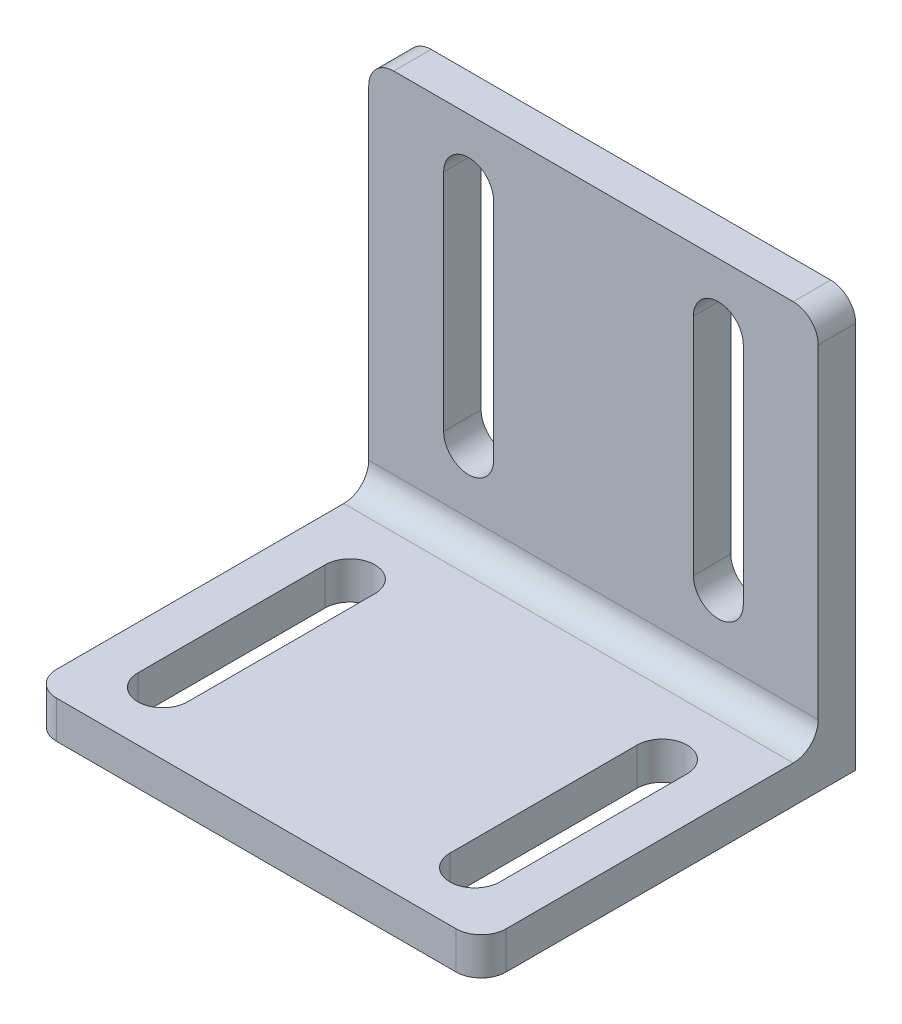
ISO-10303-21;
HEADER;
FILE_DESCRIPTION(('STEP AP214'),'2;1');
FILE_NAME('part.step','',(''),(''),'','','');
FILE_SCHEMA(('AUTOMOTIVE_DESIGN { 1 0 10303 214 1 1 1 1 }'));
ENDSEC;
DATA;
#1=APPLICATION_CONTEXT('core data for automotive mechanical design processes');
#2=APPLICATION_PROTOCOL_DEFINITION('international standard','automotive_design',2000,#1);
#3=PRODUCT_CONTEXT('',#1,'mechanical');
#4=PRODUCT('Part','Part','',(#3));
#5=PRODUCT_RELATED_PRODUCT_CATEGORY('part','',(#4));
#6=PRODUCT_DEFINITION_FORMATION('','',#4);
#7=PRODUCT_DEFINITION_CONTEXT('part definition',#1,'design');
#8=PRODUCT_DEFINITION('design','',#6,#7);
#9=PRODUCT_DEFINITION_SHAPE('','',#8);
#10=(LENGTH_UNIT() NAMED_UNIT(*) SI_UNIT(.MILLI.,.METRE.));
#11=(NAMED_UNIT(*) PLANE_ANGLE_UNIT() SI_UNIT($,.RADIAN.));
#12=(NAMED_UNIT(*) SI_UNIT($,.STERADIAN.) SOLID_ANGLE_UNIT());
#13=UNCERTAINTY_MEASURE_WITH_UNIT(LENGTH_MEASURE(1.E-05),#10,'distance_accuracy_value','');
#14=(GEOMETRIC_REPRESENTATION_CONTEXT(3) GLOBAL_UNCERTAINTY_ASSIGNED_CONTEXT((#13)) GLOBAL_UNIT_ASSIGNED_CONTEXT((#10,
#11,#12)) REPRESENTATION_CONTEXT('',''));
#15=CARTESIAN_POINT('',(0.,0.,0.));
#16=DIRECTION('',(0.,0.,1.));
#17=DIRECTION('',(1.,0.,0.));
#18=AXIS2_PLACEMENT_3D('',#15,#16,#17);
#19=CARTESIAN_POINT('',(0.,3.,0.));
#20=DIRECTION('',(0.,-1.,0.));
#21=DIRECTION('',(0.,0.,-1.));
#22=AXIS2_PLACEMENT_3D('',#19,#20,#21);
#23=PLANE('',#22);
#24=CARTESIAN_POINT('',(12.5,3.,0.510869565217398));
#25=DIRECTION('',(0.,1.,0.));
#26=DIRECTION('',(0.,0.,1.));
#27=AXIS2_PLACEMENT_3D('',#24,#25,#26);
#28=CIRCLE('',#27,2.);
#29=CARTESIAN_POINT('',(14.5,3.,0.510869565217398));
#30=VERTEX_POINT('',#29);
#31=CARTESIAN_POINT('',(10.5,3.,0.510869565217398));
#32=VERTEX_POINT('',#31);
#33=EDGE_CURVE('E336',#30,#32,#28,.T.);
#34=ORIENTED_EDGE('',*,*,#33,.F.);
#35=DIRECTION('',(0.,0.,-1.));
#36=VECTOR('',#35,1.);
#37=CARTESIAN_POINT('',(14.5,3.,0.510869565217398));
#38=LINE('',#37,#36);
#39=CARTESIAN_POINT('',(14.5,3.,15.5108695652174));
#40=VERTEX_POINT('',#39);
#41=EDGE_CURVE('E347',#40,#30,#38,.T.);
#42=ORIENTED_EDGE('',*,*,#41,.F.);
#43=CARTESIAN_POINT('',(12.5,3.,15.5108695652174));
#44=DIRECTION('',(0.,1.,0.));
#45=DIRECTION('',(0.,0.,1.));
#46=AXIS2_PLACEMENT_3D('',#43,#44,#45);
#47=CIRCLE('',#46,2.);
#48=CARTESIAN_POINT('',(10.5,3.,15.5108695652174));
#49=VERTEX_POINT('',#48);
#50=EDGE_CURVE('E343',#49,#40,#47,.T.);
#51=ORIENTED_EDGE('',*,*,#50,.F.);
#52=DIRECTION('',(0.,0.,1.));
#53=VECTOR('',#52,1.);
#54=CARTESIAN_POINT('',(10.5,3.,0.510869565217398));
#55=LINE('',#54,#53);
#56=EDGE_CURVE('E339',#32,#49,#55,.T.);
#57=ORIENTED_EDGE('',*,*,#56,.F.);
#58=EDGE_LOOP('',(#34,#42,#51,#57));
#59=FACE_BOUND('',#58,.T.);
#60=CARTESIAN_POINT('',(-12.5,3.,0.510869565217398));
#61=DIRECTION('',(0.,1.,0.));
#62=DIRECTION('',(0.,0.,1.));
#63=AXIS2_PLACEMENT_3D('',#60,#61,#62);
#64=CIRCLE('',#63,2.);
#65=CARTESIAN_POINT('',(-10.5,3.,0.510869565217398));
#66=VERTEX_POINT('',#65);
#67=CARTESIAN_POINT('',(-14.5,3.,0.510869565217399));
#68=VERTEX_POINT('',#67);
#69=EDGE_CURVE('E379',#66,#68,#64,.T.);
#70=ORIENTED_EDGE('',*,*,#69,.F.);
#71=DIRECTION('',(0.,0.,-1.));
#72=VECTOR('',#71,1.);
#73=CARTESIAN_POINT('',(-10.5,3.,0.510869565217398));
#74=LINE('',#73,#72);
#75=CARTESIAN_POINT('',(-10.5,3.,15.5108695652174));
#76=VERTEX_POINT('',#75);
#77=EDGE_CURVE('E390',#76,#66,#74,.T.);
#78=ORIENTED_EDGE('',*,*,#77,.F.);
#79=CARTESIAN_POINT('',(-12.5,3.,15.5108695652174));
#80=DIRECTION('',(0.,1.,0.));
#81=DIRECTION('',(0.,0.,1.));
#82=AXIS2_PLACEMENT_3D('',#79,#80,#81);
#83=CIRCLE('',#82,2.);
#84=CARTESIAN_POINT('',(-14.5,3.,15.5108695652174));
#85=VERTEX_POINT('',#84);
#86=EDGE_CURVE('E386',#85,#76,#83,.T.);
#87=ORIENTED_EDGE('',*,*,#86,.F.);
#88=DIRECTION('',(0.,0.,1.));
#89=VECTOR('',#88,1.);
#90=CARTESIAN_POINT('',(-14.5,3.,0.510869565217399));
#91=LINE('',#90,#89);
#92=EDGE_CURVE('E382',#68,#85,#91,.T.);
#93=ORIENTED_EDGE('',*,*,#92,.F.);
#94=EDGE_LOOP('',(#70,#78,#87,#93));
#95=FACE_BOUND('',#94,.T.);
#96=DIRECTION('',(0.,0.,-1.));
#97=VECTOR('',#96,1.);
#98=CARTESIAN_POINT('',(18.,3.,-9.4891304347826));
#99=LINE('',#98,#97);
#100=CARTESIAN_POINT('',(18.,3.,18.5108695652174));
#101=VERTEX_POINT('',#100);
#102=CARTESIAN_POINT('',(18.,3.,-4.4891304347826));
#103=VERTEX_POINT('',#102);
#104=EDGE_CURVE('E430',#101,#103,#99,.T.);
#105=ORIENTED_EDGE('',*,*,#104,.T.);
#106=DIRECTION('',(1.,0.,0.));
#107=VECTOR('',#106,1.);
#108=CARTESIAN_POINT('',(-18.,3.,-4.4891304347826));
#109=LINE('',#108,#107);
#110=CARTESIAN_POINT('',(-18.,3.,-4.4891304347826));
#111=VERTEX_POINT('',#110);
#112=EDGE_CURVE('E58',#103,#111,#109,.F.);
#113=ORIENTED_EDGE('',*,*,#112,.T.);
#114=DIRECTION('',(0.,0.,1.));
#115=VECTOR('',#114,1.);
#116=CARTESIAN_POINT('',(-18.,3.,-9.4891304347826));
#117=LINE('',#116,#115);
#118=CARTESIAN_POINT('',(-18.,3.,18.5108695652174));
#119=VERTEX_POINT('',#118);
#120=EDGE_CURVE('E422',#111,#119,#117,.T.);
#121=ORIENTED_EDGE('',*,*,#120,.T.);
#122=CARTESIAN_POINT('',(-16.,3.,18.5108695652174));
#123=DIRECTION('',(0.,-1.,0.));
#124=DIRECTION('',(0.,0.,-1.));
#125=AXIS2_PLACEMENT_3D('',#122,#123,#124);
#126=CIRCLE('',#125,2.);
#127=CARTESIAN_POINT('',(-16.,3.,20.5108695652174));
#128=VERTEX_POINT('',#127);
#129=EDGE_CURVE('E500',#119,#128,#126,.F.);
#130=ORIENTED_EDGE('',*,*,#129,.T.);
#131=DIRECTION('',(1.,0.,0.));
#132=VECTOR('',#131,1.);
#133=CARTESIAN_POINT('',(-18.,3.,20.5108695652174));
#134=LINE('',#133,#132);
#135=CARTESIAN_POINT('',(16.,3.,20.5108695652174));
#136=VERTEX_POINT('',#135);
#137=EDGE_CURVE('E425',#128,#136,#134,.T.);
#138=ORIENTED_EDGE('',*,*,#137,.T.);
#139=CARTESIAN_POINT('',(16.,3.,18.5108695652174));
#140=DIRECTION('',(0.,-1.,0.));
#141=DIRECTION('',(0.,0.,-1.));
#142=AXIS2_PLACEMENT_3D('',#139,#140,#141);
#143=CIRCLE('',#142,2.);
#144=EDGE_CURVE('E503',#136,#101,#143,.F.);
#145=ORIENTED_EDGE('',*,*,#144,.T.);
#146=EDGE_LOOP('',(#105,#113,#121,#130,#138,#145));
#147=FACE_BOUND('',#146,.T.);
#148=ADVANCED_FACE('F42',(#59,#95,#147),#23,.F.);
#149=CARTESIAN_POINT('',(0.,0.,0.));
#150=DIRECTION('',(0.,-1.,0.));
#151=DIRECTION('',(0.,0.,-1.));
#152=AXIS2_PLACEMENT_3D('',#149,#150,#151);
#153=PLANE('',#152);
#154=DIRECTION('',(0.,0.,-1.));
#155=VECTOR('',#154,1.);
#156=CARTESIAN_POINT('',(18.,0.,-9.4891304347826));
#157=LINE('',#156,#155);
#158=CARTESIAN_POINT('',(18.,0.,18.5108695652174));
#159=VERTEX_POINT('',#158);
#160=CARTESIAN_POINT('',(18.,0.,-9.4891304347826));
#161=VERTEX_POINT('',#160);
#162=EDGE_CURVE('E426',#159,#161,#157,.T.);
#163=ORIENTED_EDGE('',*,*,#162,.F.);
#164=CARTESIAN_POINT('',(16.,0.,18.5108695652174));
#165=DIRECTION('',(0.,-1.,0.));
#166=DIRECTION('',(0.,0.,-1.));
#167=AXIS2_PLACEMENT_3D('',#164,#165,#166);
#168=CIRCLE('',#167,2.);
#169=CARTESIAN_POINT('',(16.,0.,20.5108695652174));
#170=VERTEX_POINT('',#169);
#171=EDGE_CURVE('E490',#159,#170,#168,.T.);
#172=ORIENTED_EDGE('',*,*,#171,.T.);
#173=DIRECTION('',(1.,0.,0.));
#174=VECTOR('',#173,1.);
#175=CARTESIAN_POINT('',(18.,0.,20.5108695652174));
#176=LINE('',#175,#174);
#177=CARTESIAN_POINT('',(-16.,0.,20.5108695652174));
#178=VERTEX_POINT('',#177);
#179=EDGE_CURVE('E441',#178,#170,#176,.T.);
#180=ORIENTED_EDGE('',*,*,#179,.F.);
#181=CARTESIAN_POINT('',(-16.,0.,18.5108695652174));
#182=DIRECTION('',(0.,-1.,0.));
#183=DIRECTION('',(0.,0.,-1.));
#184=AXIS2_PLACEMENT_3D('',#181,#182,#183);
#185=CIRCLE('',#184,2.);
#186=CARTESIAN_POINT('',(-18.,0.,18.5108695652174));
#187=VERTEX_POINT('',#186);
#188=EDGE_CURVE('E487',#178,#187,#185,.T.);
#189=ORIENTED_EDGE('',*,*,#188,.T.);
#190=DIRECTION('',(0.,0.,1.));
#191=VECTOR('',#190,1.);
#192=CARTESIAN_POINT('',(-18.,0.,-9.4891304347826));
#193=LINE('',#192,#191);
#194=CARTESIAN_POINT('',(-18.,0.,-9.4891304347826));
#195=VERTEX_POINT('',#194);
#196=EDGE_CURVE('E437',#195,#187,#193,.T.);
#197=ORIENTED_EDGE('',*,*,#196,.F.);
#198=DIRECTION('',(-1.,0.,0.));
#199=VECTOR('',#198,1.);
#200=CARTESIAN_POINT('',(0.,0.,-9.4891304347826));
#201=LINE('',#200,#199);
#202=EDGE_CURVE('E421',#161,#195,#201,.T.);
#203=ORIENTED_EDGE('',*,*,#202,.F.);
#204=EDGE_LOOP('',(#163,#172,#180,#189,#197,#203));
#205=FACE_BOUND('',#204,.T.);
#206=DIRECTION('',(0.,0.,-1.));
#207=VECTOR('',#206,1.);
#208=CARTESIAN_POINT('',(-10.5,0.,0.510869565217398));
#209=LINE('',#208,#207);
#210=CARTESIAN_POINT('',(-10.5,0.,15.5108695652174));
#211=VERTEX_POINT('',#210);
#212=CARTESIAN_POINT('',(-10.5,0.,0.510869565217398));
#213=VERTEX_POINT('',#212);
#214=EDGE_CURVE('E383',#211,#213,#209,.T.);
#215=ORIENTED_EDGE('',*,*,#214,.T.);
#216=CARTESIAN_POINT('',(-12.5,0.,0.510869565217398));
#217=DIRECTION('',(0.,1.,0.));
#218=DIRECTION('',(0.,0.,1.));
#219=AXIS2_PLACEMENT_3D('',#216,#217,#218);
#220=CIRCLE('',#219,2.);
#221=CARTESIAN_POINT('',(-14.5,0.,0.510869565217399));
#222=VERTEX_POINT('',#221);
#223=EDGE_CURVE('E378',#213,#222,#220,.T.);
#224=ORIENTED_EDGE('',*,*,#223,.T.);
#225=DIRECTION('',(0.,0.,1.));
#226=VECTOR('',#225,1.);
#227=CARTESIAN_POINT('',(-14.5,0.,0.510869565217399));
#228=LINE('',#227,#226);
#229=CARTESIAN_POINT('',(-14.5,0.,15.5108695652174));
#230=VERTEX_POINT('',#229);
#231=EDGE_CURVE('E397',#222,#230,#228,.T.);
#232=ORIENTED_EDGE('',*,*,#231,.T.);
#233=CARTESIAN_POINT('',(-12.5,0.,15.5108695652174));
#234=DIRECTION('',(0.,1.,0.));
#235=DIRECTION('',(0.,0.,1.));
#236=AXIS2_PLACEMENT_3D('',#233,#234,#235);
#237=CIRCLE('',#236,2.);
#238=EDGE_CURVE('E401',#230,#211,#237,.T.);
#239=ORIENTED_EDGE('',*,*,#238,.T.);
#240=EDGE_LOOP('',(#215,#224,#232,#239));
#241=FACE_BOUND('',#240,.T.);
#242=DIRECTION('',(0.,0.,-1.));
#243=VECTOR('',#242,1.);
#244=CARTESIAN_POINT('',(14.5,0.,0.510869565217398));
#245=LINE('',#244,#243);
#246=CARTESIAN_POINT('',(14.5,0.,15.5108695652174));
#247=VERTEX_POINT('',#246);
#248=CARTESIAN_POINT('',(14.5,0.,0.510869565217398));
#249=VERTEX_POINT('',#248);
#250=EDGE_CURVE('E340',#247,#249,#245,.T.);
#251=ORIENTED_EDGE('',*,*,#250,.T.);
#252=CARTESIAN_POINT('',(12.5,0.,0.510869565217398));
#253=DIRECTION('',(0.,1.,0.));
#254=DIRECTION('',(0.,0.,1.));
#255=AXIS2_PLACEMENT_3D('',#252,#253,#254);
#256=CIRCLE('',#255,2.);
#257=CARTESIAN_POINT('',(10.5,0.,0.510869565217398));
#258=VERTEX_POINT('',#257);
#259=EDGE_CURVE('E335',#249,#258,#256,.T.);
#260=ORIENTED_EDGE('',*,*,#259,.T.);
#261=DIRECTION('',(0.,0.,1.));
#262=VECTOR('',#261,1.);
#263=CARTESIAN_POINT('',(10.5,0.,0.510869565217398));
#264=LINE('',#263,#262);
#265=CARTESIAN_POINT('',(10.5,0.,15.5108695652174));
#266=VERTEX_POINT('',#265);
#267=EDGE_CURVE('E354',#258,#266,#264,.T.);
#268=ORIENTED_EDGE('',*,*,#267,.T.);
#269=CARTESIAN_POINT('',(12.5,0.,15.5108695652174));
#270=DIRECTION('',(0.,1.,0.));
#271=DIRECTION('',(0.,0.,1.));
#272=AXIS2_PLACEMENT_3D('',#269,#270,#271);
#273=CIRCLE('',#272,2.);
#274=EDGE_CURVE('E358',#266,#247,#273,.T.);
#275=ORIENTED_EDGE('',*,*,#274,.T.);
#276=EDGE_LOOP('',(#251,#260,#268,#275));
#277=FACE_BOUND('',#276,.T.);
#278=ADVANCED_FACE('F546',(#205,#241,#277),#153,.T.);
#279=CARTESIAN_POINT('',(0.,3.,-9.4891304347826));
#280=DIRECTION('',(0.,0.,1.));
#281=DIRECTION('',(1.,0.,0.));
#282=AXIS2_PLACEMENT_3D('',#279,#280,#281);
#283=PLANE('',#282);
#284=DIRECTION('',(0.,1.,0.));
#285=VECTOR('',#284,1.);
#286=CARTESIAN_POINT('',(-8.,28.,-9.4891304347826));
#287=LINE('',#286,#285);
#288=CARTESIAN_POINT('',(-8.,10.,-9.4891304347826));
#289=VERTEX_POINT('',#288);
#290=CARTESIAN_POINT('',(-8.,28.,-9.4891304347826));
#291=VERTEX_POINT('',#290);
#292=EDGE_CURVE('E234',#289,#291,#287,.T.);
#293=ORIENTED_EDGE('',*,*,#292,.T.);
#294=CARTESIAN_POINT('',(-10.,28.,-9.4891304347826));
#295=DIRECTION('',(0.,0.,1.));
#296=DIRECTION('',(1.,0.,0.));
#297=AXIS2_PLACEMENT_3D('',#294,#295,#296);
#298=CIRCLE('',#297,2.);
#299=CARTESIAN_POINT('',(-12.,28.,-9.4891304347826));
#300=VERTEX_POINT('',#299);
#301=EDGE_CURVE('E225',#291,#300,#298,.T.);
#302=ORIENTED_EDGE('',*,*,#301,.T.);
#303=DIRECTION('',(0.,-1.,0.));
#304=VECTOR('',#303,1.);
#305=CARTESIAN_POINT('',(-12.,28.,-9.4891304347826));
#306=LINE('',#305,#304);
#307=CARTESIAN_POINT('',(-12.,10.,-9.4891304347826));
#308=VERTEX_POINT('',#307);
#309=EDGE_CURVE('E238',#300,#308,#306,.T.);
#310=ORIENTED_EDGE('',*,*,#309,.T.);
#311=CARTESIAN_POINT('',(-9.99999999999999,10.,-9.4891304347826));
#312=DIRECTION('',(0.,0.,1.));
#313=DIRECTION('',(1.,0.,0.));
#314=AXIS2_PLACEMENT_3D('',#311,#312,#313);
#315=CIRCLE('',#314,2.);
#316=EDGE_CURVE('E243',#308,#289,#315,.T.);
#317=ORIENTED_EDGE('',*,*,#316,.T.);
#318=EDGE_LOOP('',(#293,#302,#310,#317));
#319=FACE_BOUND('',#318,.T.);
#320=DIRECTION('',(0.,1.,0.));
#321=VECTOR('',#320,1.);
#322=CARTESIAN_POINT('',(12.,28.,-9.4891304347826));
#323=LINE('',#322,#321);
#324=CARTESIAN_POINT('',(12.,10.,-9.4891304347826));
#325=VERTEX_POINT('',#324);
#326=CARTESIAN_POINT('',(12.,28.,-9.4891304347826));
#327=VERTEX_POINT('',#326);
#328=EDGE_CURVE('E282',#325,#327,#323,.T.);
#329=ORIENTED_EDGE('',*,*,#328,.T.);
#330=CARTESIAN_POINT('',(10.,28.,-9.4891304347826));
#331=DIRECTION('',(0.,0.,1.));
#332=DIRECTION('',(-1.,0.,0.));
#333=AXIS2_PLACEMENT_3D('',#330,#331,#332);
#334=CIRCLE('',#333,2.);
#335=CARTESIAN_POINT('',(8.,28.,-9.4891304347826));
#336=VERTEX_POINT('',#335);
#337=EDGE_CURVE('E297',#327,#336,#334,.T.);
#338=ORIENTED_EDGE('',*,*,#337,.T.);
#339=DIRECTION('',(0.,-1.,0.));
#340=VECTOR('',#339,1.);
#341=CARTESIAN_POINT('',(8.,28.,-9.4891304347826));
#342=LINE('',#341,#340);
#343=CARTESIAN_POINT('',(8.,10.,-9.48913043478261));
#344=VERTEX_POINT('',#343);
#345=EDGE_CURVE('E314',#336,#344,#342,.T.);
#346=ORIENTED_EDGE('',*,*,#345,.T.);
#347=CARTESIAN_POINT('',(10.,10.,-9.4891304347826));
#348=DIRECTION('',(0.,0.,1.));
#349=DIRECTION('',(-1.,0.,0.));
#350=AXIS2_PLACEMENT_3D('',#347,#348,#349);
#351=CIRCLE('',#350,2.);
#352=EDGE_CURVE('E310',#344,#325,#351,.T.);
#353=ORIENTED_EDGE('',*,*,#352,.T.);
#354=EDGE_LOOP('',(#329,#338,#346,#353));
#355=FACE_BOUND('',#354,.T.);
#356=DIRECTION('',(0.,-1.,0.));
#357=VECTOR('',#356,1.);
#358=CARTESIAN_POINT('',(-18.,3.,-9.4891304347826));
#359=LINE('',#358,#357);
#360=CARTESIAN_POINT('',(-18.,31.,-9.4891304347826));
#361=VERTEX_POINT('',#360);
#362=EDGE_CURVE('E450',#361,#195,#359,.T.);
#363=ORIENTED_EDGE('',*,*,#362,.F.);
#364=CARTESIAN_POINT('',(-16.,31.,-9.4891304347826));
#365=DIRECTION('',(0.,0.,1.));
#366=DIRECTION('',(1.,0.,0.));
#367=AXIS2_PLACEMENT_3D('',#364,#365,#366);
#368=CIRCLE('',#367,2.);
#369=CARTESIAN_POINT('',(-16.,33.,-9.4891304347826));
#370=VERTEX_POINT('',#369);
#371=EDGE_CURVE('E477',#361,#370,#368,.F.);
#372=ORIENTED_EDGE('',*,*,#371,.T.);
#373=DIRECTION('',(-1.,0.,0.));
#374=VECTOR('',#373,1.);
#375=CARTESIAN_POINT('',(18.,33.,-9.4891304347826));
#376=LINE('',#375,#374);
#377=CARTESIAN_POINT('',(16.,33.,-9.4891304347826));
#378=VERTEX_POINT('',#377);
#379=EDGE_CURVE('E324',#378,#370,#376,.T.);
#380=ORIENTED_EDGE('',*,*,#379,.F.);
#381=CARTESIAN_POINT('',(16.,31.,-9.48913043478261));
#382=DIRECTION('',(0.,0.,1.));
#383=DIRECTION('',(1.,0.,0.));
#384=AXIS2_PLACEMENT_3D('',#381,#382,#383);
#385=CIRCLE('',#384,2.);
#386=CARTESIAN_POINT('',(18.,31.,-9.4891304347826));
#387=VERTEX_POINT('',#386);
#388=EDGE_CURVE('E474',#378,#387,#385,.F.);
#389=ORIENTED_EDGE('',*,*,#388,.T.);
#390=DIRECTION('',(0.,-1.,0.));
#391=VECTOR('',#390,1.);
#392=CARTESIAN_POINT('',(18.,3.,-9.4891304347826));
#393=LINE('',#392,#391);
#394=EDGE_CURVE('E433',#387,#161,#393,.T.);
#395=ORIENTED_EDGE('',*,*,#394,.T.);
#396=ORIENTED_EDGE('',*,*,#202,.T.);
#397=EDGE_LOOP('',(#363,#372,#380,#389,#395,#396));
#398=FACE_BOUND('',#397,.T.);
#399=ADVANCED_FACE('F245',(#319,#355,#398),#283,.F.);
#400=CARTESIAN_POINT('',(-18.,3.,-9.4891304347826));
#401=DIRECTION('',(1.,0.,0.));
#402=DIRECTION('',(0.,0.,-1.));
#403=AXIS2_PLACEMENT_3D('',#400,#401,#402);
#404=PLANE('',#403);
#405=DIRECTION('',(0.,-1.,0.));
#406=VECTOR('',#405,1.);
#407=CARTESIAN_POINT('',(-18.,33.,-6.4891304347826));
#408=LINE('',#407,#406);
#409=CARTESIAN_POINT('',(-18.,31.,-6.4891304347826));
#410=VERTEX_POINT('',#409);
#411=CARTESIAN_POINT('',(-18.,5.,-6.4891304347826));
#412=VERTEX_POINT('',#411);
#413=EDGE_CURVE('E331',#410,#412,#408,.T.);
#414=ORIENTED_EDGE('',*,*,#413,.F.);
#415=DIRECTION('',(0.,0.,1.));
#416=VECTOR('',#415,1.);
#417=CARTESIAN_POINT('',(-18.,31.,-9.4891304347826));
#418=LINE('',#417,#416);
#419=EDGE_CURVE('E471',#410,#361,#418,.F.);
#420=ORIENTED_EDGE('',*,*,#419,.T.);
#421=ORIENTED_EDGE('',*,*,#362,.T.);
#422=ORIENTED_EDGE('',*,*,#196,.T.);
#423=DIRECTION('',(0.,-1.,0.));
#424=VECTOR('',#423,1.);
#425=CARTESIAN_POINT('',(-18.,3.,18.5108695652174));
#426=LINE('',#425,#424);
#427=EDGE_CURVE('E467',#187,#119,#426,.F.);
#428=ORIENTED_EDGE('',*,*,#427,.T.);
#429=ORIENTED_EDGE('',*,*,#120,.F.);
#430=CARTESIAN_POINT('',(-18.,5.,-4.4891304347826));
#431=DIRECTION('',(1.,0.,0.));
#432=DIRECTION('',(0.,0.,-1.));
#433=AXIS2_PLACEMENT_3D('',#430,#431,#432);
#434=CIRCLE('',#433,2.);
#435=EDGE_CURVE('E11',#111,#412,#434,.T.);
#436=ORIENTED_EDGE('',*,*,#435,.T.);
#437=EDGE_LOOP('',(#414,#420,#421,#422,#428,#429,#436));
#438=FACE_BOUND('',#437,.T.);
#439=ADVANCED_FACE('F536',(#438),#404,.F.);
#440=CARTESIAN_POINT('',(18.,3.,20.5108695652174));
#441=DIRECTION('',(0.,0.,-1.));
#442=DIRECTION('',(-1.,0.,0.));
#443=AXIS2_PLACEMENT_3D('',#440,#441,#442);
#444=PLANE('',#443);
#445=ORIENTED_EDGE('',*,*,#179,.T.);
#446=DIRECTION('',(0.,-1.,0.));
#447=VECTOR('',#446,1.);
#448=CARTESIAN_POINT('',(16.,3.,20.5108695652174));
#449=LINE('',#448,#447);
#450=EDGE_CURVE('E497',#170,#136,#449,.F.);
#451=ORIENTED_EDGE('',*,*,#450,.T.);
#452=ORIENTED_EDGE('',*,*,#137,.F.);
#453=DIRECTION('',(0.,-1.,0.));
#454=VECTOR('',#453,1.);
#455=CARTESIAN_POINT('',(-16.,3.,20.5108695652174));
#456=LINE('',#455,#454);
#457=EDGE_CURVE('E493',#128,#178,#456,.T.);
#458=ORIENTED_EDGE('',*,*,#457,.T.);
#459=EDGE_LOOP('',(#445,#451,#452,#458));
#460=FACE_BOUND('',#459,.T.);
#461=ADVANCED_FACE('F564',(#460),#444,.F.);
#462=CARTESIAN_POINT('',(18.,3.,-9.4891304347826));
#463=DIRECTION('',(-1.,0.,0.));
#464=DIRECTION('',(0.,0.,1.));
#465=AXIS2_PLACEMENT_3D('',#462,#463,#464);
#466=PLANE('',#465);
#467=ORIENTED_EDGE('',*,*,#394,.F.);
#468=DIRECTION('',(0.,0.,-1.));
#469=VECTOR('',#468,1.);
#470=CARTESIAN_POINT('',(18.,31.,-6.4891304347826));
#471=LINE('',#470,#469);
#472=CARTESIAN_POINT('',(18.,31.,-6.4891304347826));
#473=VERTEX_POINT('',#472);
#474=EDGE_CURVE('E484',#387,#473,#471,.F.);
#475=ORIENTED_EDGE('',*,*,#474,.T.);
#476=DIRECTION('',(0.,-1.,0.));
#477=VECTOR('',#476,1.);
#478=CARTESIAN_POINT('',(18.,33.,-6.4891304347826));
#479=LINE('',#478,#477);
#480=CARTESIAN_POINT('',(18.,5.,-6.4891304347826));
#481=VERTEX_POINT('',#480);
#482=EDGE_CURVE('E328',#473,#481,#479,.T.);
#483=ORIENTED_EDGE('',*,*,#482,.T.);
#484=CARTESIAN_POINT('',(18.,5.,-4.4891304347826));
#485=DIRECTION('',(-1.,0.,0.));
#486=DIRECTION('',(0.,0.,1.));
#487=AXIS2_PLACEMENT_3D('',#484,#485,#486);
#488=CIRCLE('',#487,2.);
#489=EDGE_CURVE('E51',#481,#103,#488,.T.);
#490=ORIENTED_EDGE('',*,*,#489,.T.);
#491=ORIENTED_EDGE('',*,*,#104,.F.);
#492=DIRECTION('',(0.,-1.,0.));
#493=VECTOR('',#492,1.);
#494=CARTESIAN_POINT('',(18.,3.,18.5108695652174));
#495=LINE('',#494,#493);
#496=EDGE_CURVE('E480',#101,#159,#495,.T.);
#497=ORIENTED_EDGE('',*,*,#496,.T.);
#498=ORIENTED_EDGE('',*,*,#162,.T.);
#499=EDGE_LOOP('',(#467,#475,#483,#490,#491,#497,#498));
#500=FACE_BOUND('',#499,.T.);
#501=ADVANCED_FACE('F521',(#500),#466,.F.);
#502=CARTESIAN_POINT('',(-12.5,3.,0.510869565217398));
#503=DIRECTION('',(0.,-1.,0.));
#504=DIRECTION('',(0.,0.,-1.));
#505=AXIS2_PLACEMENT_3D('',#502,#503,#504);
#506=CYLINDRICAL_SURFACE('',#505,2.);
#507=ORIENTED_EDGE('',*,*,#223,.F.);
#508=DIRECTION('',(0.,-1.,0.));
#509=VECTOR('',#508,1.);
#510=CARTESIAN_POINT('',(-10.5,3.,0.510869565217398));
#511=LINE('',#510,#509);
#512=EDGE_CURVE('E393',#66,#213,#511,.T.);
#513=ORIENTED_EDGE('',*,*,#512,.F.);
#514=ORIENTED_EDGE('',*,*,#69,.T.);
#515=DIRECTION('',(0.,-1.,0.));
#516=VECTOR('',#515,1.);
#517=CARTESIAN_POINT('',(-14.5,3.,0.510869565217399));
#518=LINE('',#517,#516);
#519=EDGE_CURVE('E417',#68,#222,#518,.T.);
#520=ORIENTED_EDGE('',*,*,#519,.T.);
#521=EDGE_LOOP('',(#507,#513,#514,#520));
#522=FACE_BOUND('',#521,.T.);
#523=ADVANCED_FACE('F559',(#522),#506,.F.);
#524=CARTESIAN_POINT('',(-14.5,3.,0.510869565217399));
#525=DIRECTION('',(1.,0.,0.));
#526=DIRECTION('',(0.,0.,-1.));
#527=AXIS2_PLACEMENT_3D('',#524,#525,#526);
#528=PLANE('',#527);
#529=ORIENTED_EDGE('',*,*,#231,.F.);
#530=ORIENTED_EDGE('',*,*,#519,.F.);
#531=ORIENTED_EDGE('',*,*,#92,.T.);
#532=DIRECTION('',(0.,-1.,0.));
#533=VECTOR('',#532,1.);
#534=CARTESIAN_POINT('',(-14.5,3.,15.5108695652174));
#535=LINE('',#534,#533);
#536=EDGE_CURVE('E414',#85,#230,#535,.T.);
#537=ORIENTED_EDGE('',*,*,#536,.T.);
#538=EDGE_LOOP('',(#529,#530,#531,#537));
#539=FACE_BOUND('',#538,.T.);
#540=ADVANCED_FACE('F628',(#539),#528,.T.);
#541=CARTESIAN_POINT('',(-12.5,3.,15.5108695652174));
#542=DIRECTION('',(0.,-1.,0.));
#543=DIRECTION('',(0.,0.,-1.));
#544=AXIS2_PLACEMENT_3D('',#541,#542,#543);
#545=CYLINDRICAL_SURFACE('',#544,2.);
#546=ORIENTED_EDGE('',*,*,#238,.F.);
#547=ORIENTED_EDGE('',*,*,#536,.F.);
#548=ORIENTED_EDGE('',*,*,#86,.T.);
#549=DIRECTION('',(0.,-1.,0.));
#550=VECTOR('',#549,1.);
#551=CARTESIAN_POINT('',(-10.5,3.,15.5108695652174));
#552=LINE('',#551,#550);
#553=EDGE_CURVE('E411',#76,#211,#552,.T.);
#554=ORIENTED_EDGE('',*,*,#553,.T.);
#555=EDGE_LOOP('',(#546,#547,#548,#554));
#556=FACE_BOUND('',#555,.T.);
#557=ADVANCED_FACE('F625',(#556),#545,.F.);
#558=CARTESIAN_POINT('',(-10.5,3.,0.510869565217398));
#559=DIRECTION('',(-1.,0.,0.));
#560=DIRECTION('',(0.,0.,1.));
#561=AXIS2_PLACEMENT_3D('',#558,#559,#560);
#562=PLANE('',#561);
#563=ORIENTED_EDGE('',*,*,#214,.F.);
#564=ORIENTED_EDGE('',*,*,#553,.F.);
#565=ORIENTED_EDGE('',*,*,#77,.T.);
#566=ORIENTED_EDGE('',*,*,#512,.T.);
#567=EDGE_LOOP('',(#563,#564,#565,#566));
#568=FACE_BOUND('',#567,.T.);
#569=ADVANCED_FACE('F622',(#568),#562,.T.);
#570=CARTESIAN_POINT('',(12.5,3.,0.510869565217398));
#571=DIRECTION('',(0.,-1.,0.));
#572=DIRECTION('',(0.,0.,-1.));
#573=AXIS2_PLACEMENT_3D('',#570,#571,#572);
#574=CYLINDRICAL_SURFACE('',#573,2.);
#575=ORIENTED_EDGE('',*,*,#259,.F.);
#576=DIRECTION('',(0.,-1.,0.));
#577=VECTOR('',#576,1.);
#578=CARTESIAN_POINT('',(14.5,3.,0.510869565217398));
#579=LINE('',#578,#577);
#580=EDGE_CURVE('E350',#30,#249,#579,.T.);
#581=ORIENTED_EDGE('',*,*,#580,.F.);
#582=ORIENTED_EDGE('',*,*,#33,.T.);
#583=DIRECTION('',(0.,-1.,0.));
#584=VECTOR('',#583,1.);
#585=CARTESIAN_POINT('',(10.5,3.,0.510869565217398));
#586=LINE('',#585,#584);
#587=EDGE_CURVE('E374',#32,#258,#586,.T.);
#588=ORIENTED_EDGE('',*,*,#587,.T.);
#589=EDGE_LOOP('',(#575,#581,#582,#588));
#590=FACE_BOUND('',#589,.T.);
#591=ADVANCED_FACE('F601',(#590),#574,.F.);
#592=CARTESIAN_POINT('',(10.5,3.,0.510869565217398));
#593=DIRECTION('',(1.,0.,0.));
#594=DIRECTION('',(0.,0.,-1.));
#595=AXIS2_PLACEMENT_3D('',#592,#593,#594);
#596=PLANE('',#595);
#597=ORIENTED_EDGE('',*,*,#267,.F.);
#598=ORIENTED_EDGE('',*,*,#587,.F.);
#599=ORIENTED_EDGE('',*,*,#56,.T.);
#600=DIRECTION('',(0.,-1.,0.));
#601=VECTOR('',#600,1.);
#602=CARTESIAN_POINT('',(10.5,3.,15.5108695652174));
#603=LINE('',#602,#601);
#604=EDGE_CURVE('E371',#49,#266,#603,.T.);
#605=ORIENTED_EDGE('',*,*,#604,.T.);
#606=EDGE_LOOP('',(#597,#598,#599,#605));
#607=FACE_BOUND('',#606,.T.);
#608=ADVANCED_FACE('F607',(#607),#596,.T.);
#609=CARTESIAN_POINT('',(12.5,3.,15.5108695652174));
#610=DIRECTION('',(0.,-1.,0.));
#611=DIRECTION('',(0.,0.,-1.));
#612=AXIS2_PLACEMENT_3D('',#609,#610,#611);
#613=CYLINDRICAL_SURFACE('',#612,2.);
#614=ORIENTED_EDGE('',*,*,#274,.F.);
#615=ORIENTED_EDGE('',*,*,#604,.F.);
#616=ORIENTED_EDGE('',*,*,#50,.T.);
#617=DIRECTION('',(0.,-1.,0.));
#618=VECTOR('',#617,1.);
#619=CARTESIAN_POINT('',(14.5,3.,15.5108695652174));
#620=LINE('',#619,#618);
#621=EDGE_CURVE('E368',#40,#247,#620,.T.);
#622=ORIENTED_EDGE('',*,*,#621,.T.);
#623=EDGE_LOOP('',(#614,#615,#616,#622));
#624=FACE_BOUND('',#623,.T.);
#625=ADVANCED_FACE('F609',(#624),#613,.F.);
#626=CARTESIAN_POINT('',(14.5,3.,0.510869565217398));
#627=DIRECTION('',(-1.,0.,0.));
#628=DIRECTION('',(0.,0.,1.));
#629=AXIS2_PLACEMENT_3D('',#626,#627,#628);
#630=PLANE('',#629);
#631=ORIENTED_EDGE('',*,*,#250,.F.);
#632=ORIENTED_EDGE('',*,*,#621,.F.);
#633=ORIENTED_EDGE('',*,*,#41,.T.);
#634=ORIENTED_EDGE('',*,*,#580,.T.);
#635=EDGE_LOOP('',(#631,#632,#633,#634));
#636=FACE_BOUND('',#635,.T.);
#637=ADVANCED_FACE('F597',(#636),#630,.T.);
#638=CARTESIAN_POINT('',(-18.,33.,-6.4891304347826));
#639=DIRECTION('',(0.,0.,-1.));
#640=DIRECTION('',(-1.,0.,0.));
#641=AXIS2_PLACEMENT_3D('',#638,#639,#640);
#642=PLANE('',#641);
#643=DIRECTION('',(0.,-1.,0.));
#644=VECTOR('',#643,1.);
#645=CARTESIAN_POINT('',(-12.,28.,-6.4891304347826));
#646=LINE('',#645,#644);
#647=CARTESIAN_POINT('',(-12.,28.,-6.4891304347826));
#648=VERTEX_POINT('',#647);
#649=CARTESIAN_POINT('',(-12.,10.,-6.4891304347826));
#650=VERTEX_POINT('',#649);
#651=EDGE_CURVE('E262',#648,#650,#646,.T.);
#652=ORIENTED_EDGE('',*,*,#651,.F.);
#653=CARTESIAN_POINT('',(-10.,28.,-6.4891304347826));
#654=DIRECTION('',(0.,0.,1.));
#655=DIRECTION('',(1.,0.,0.));
#656=AXIS2_PLACEMENT_3D('',#653,#654,#655);
#657=CIRCLE('',#656,2.);
#658=CARTESIAN_POINT('',(-8.,28.,-6.4891304347826));
#659=VERTEX_POINT('',#658);
#660=EDGE_CURVE('E228',#659,#648,#657,.T.);
#661=ORIENTED_EDGE('',*,*,#660,.F.);
#662=DIRECTION('',(0.,1.,0.));
#663=VECTOR('',#662,1.);
#664=CARTESIAN_POINT('',(-8.,28.,-6.4891304347826));
#665=LINE('',#664,#663);
#666=CARTESIAN_POINT('',(-8.,10.,-6.4891304347826));
#667=VERTEX_POINT('',#666);
#668=EDGE_CURVE('E249',#667,#659,#665,.T.);
#669=ORIENTED_EDGE('',*,*,#668,.F.);
#670=CARTESIAN_POINT('',(-9.99999999999999,10.,-6.4891304347826));
#671=DIRECTION('',(0.,0.,1.));
#672=DIRECTION('',(1.,0.,0.));
#673=AXIS2_PLACEMENT_3D('',#670,#671,#672);
#674=CIRCLE('',#673,2.);
#675=EDGE_CURVE('E253',#650,#667,#674,.T.);
#676=ORIENTED_EDGE('',*,*,#675,.F.);
#677=EDGE_LOOP('',(#652,#661,#669,#676));
#678=FACE_BOUND('',#677,.T.);
#679=DIRECTION('',(0.,-1.,0.));
#680=VECTOR('',#679,1.);
#681=CARTESIAN_POINT('',(8.,28.,-6.4891304347826));
#682=LINE('',#681,#680);
#683=CARTESIAN_POINT('',(8.,28.,-6.4891304347826));
#684=VERTEX_POINT('',#683);
#685=CARTESIAN_POINT('',(8.,10.,-6.4891304347826));
#686=VERTEX_POINT('',#685);
#687=EDGE_CURVE('E301',#684,#686,#682,.T.);
#688=ORIENTED_EDGE('',*,*,#687,.F.);
#689=CARTESIAN_POINT('',(10.,28.,-6.4891304347826));
#690=DIRECTION('',(0.,0.,1.));
#691=DIRECTION('',(-1.,0.,0.));
#692=AXIS2_PLACEMENT_3D('',#689,#690,#691);
#693=CIRCLE('',#692,2.);
#694=CARTESIAN_POINT('',(12.,28.,-6.4891304347826));
#695=VERTEX_POINT('',#694);
#696=EDGE_CURVE('E263',#695,#684,#693,.T.);
#697=ORIENTED_EDGE('',*,*,#696,.F.);
#698=DIRECTION('',(0.,1.,0.));
#699=VECTOR('',#698,1.);
#700=CARTESIAN_POINT('',(12.,28.,-6.4891304347826));
#701=LINE('',#700,#699);
#702=CARTESIAN_POINT('',(12.,10.,-6.4891304347826));
#703=VERTEX_POINT('',#702);
#704=EDGE_CURVE('E292',#703,#695,#701,.T.);
#705=ORIENTED_EDGE('',*,*,#704,.F.);
#706=CARTESIAN_POINT('',(10.,10.,-6.4891304347826));
#707=DIRECTION('',(0.,0.,1.));
#708=DIRECTION('',(-1.,0.,0.));
#709=AXIS2_PLACEMENT_3D('',#706,#707,#708);
#710=CIRCLE('',#709,2.);
#711=EDGE_CURVE('E296',#686,#703,#710,.T.);
#712=ORIENTED_EDGE('',*,*,#711,.F.);
#713=EDGE_LOOP('',(#688,#697,#705,#712));
#714=FACE_BOUND('',#713,.T.);
#715=ORIENTED_EDGE('',*,*,#413,.T.);
#716=DIRECTION('',(1.,0.,0.));
#717=VECTOR('',#716,1.);
#718=CARTESIAN_POINT('',(18.,5.,-6.4891304347826));
#719=LINE('',#718,#717);
#720=EDGE_CURVE('E506',#412,#481,#719,.T.);
#721=ORIENTED_EDGE('',*,*,#720,.T.);
#722=ORIENTED_EDGE('',*,*,#482,.F.);
#723=CARTESIAN_POINT('',(16.,31.,-6.4891304347826));
#724=DIRECTION('',(0.,0.,-1.));
#725=DIRECTION('',(-1.,0.,0.));
#726=AXIS2_PLACEMENT_3D('',#723,#724,#725);
#727=CIRCLE('',#726,2.);
#728=CARTESIAN_POINT('',(16.,33.,-6.4891304347826));
#729=VERTEX_POINT('',#728);
#730=EDGE_CURVE('E461',#473,#729,#727,.F.);
#731=ORIENTED_EDGE('',*,*,#730,.T.);
#732=DIRECTION('',(1.,0.,0.));
#733=VECTOR('',#732,1.);
#734=CARTESIAN_POINT('',(-18.,33.,-6.4891304347826));
#735=LINE('',#734,#733);
#736=CARTESIAN_POINT('',(-16.,33.,-6.4891304347826));
#737=VERTEX_POINT('',#736);
#738=EDGE_CURVE('E272',#737,#729,#735,.T.);
#739=ORIENTED_EDGE('',*,*,#738,.F.);
#740=CARTESIAN_POINT('',(-16.,31.,-6.4891304347826));
#741=DIRECTION('',(0.,0.,-1.));
#742=DIRECTION('',(-1.,0.,0.));
#743=AXIS2_PLACEMENT_3D('',#740,#741,#742);
#744=CIRCLE('',#743,2.);
#745=EDGE_CURVE('E464',#737,#410,#744,.F.);
#746=ORIENTED_EDGE('',*,*,#745,.T.);
#747=EDGE_LOOP('',(#715,#721,#722,#731,#739,#746));
#748=FACE_BOUND('',#747,.T.);
#749=ADVANCED_FACE('F515',(#678,#714,#748),#642,.F.);
#750=CARTESIAN_POINT('',(0.,33.,0.));
#751=DIRECTION('',(0.,1.,0.));
#752=DIRECTION('',(0.,0.,1.));
#753=AXIS2_PLACEMENT_3D('',#750,#751,#752);
#754=PLANE('',#753);
#755=ORIENTED_EDGE('',*,*,#379,.T.);
#756=DIRECTION('',(0.,0.,1.));
#757=VECTOR('',#756,1.);
#758=CARTESIAN_POINT('',(-16.,33.,-6.4891304347826));
#759=LINE('',#758,#757);
#760=EDGE_CURVE('E457',#370,#737,#759,.T.);
#761=ORIENTED_EDGE('',*,*,#760,.T.);
#762=ORIENTED_EDGE('',*,*,#738,.T.);
#763=DIRECTION('',(0.,0.,-1.));
#764=VECTOR('',#763,1.);
#765=CARTESIAN_POINT('',(16.,33.,-9.4891304347826));
#766=LINE('',#765,#764);
#767=EDGE_CURVE('E453',#729,#378,#766,.T.);
#768=ORIENTED_EDGE('',*,*,#767,.T.);
#769=EDGE_LOOP('',(#755,#761,#762,#768));
#770=FACE_BOUND('',#769,.T.);
#771=ADVANCED_FACE('F528',(#770),#754,.T.);
#772=CARTESIAN_POINT('',(10.,28.,-9.4891304347826));
#773=DIRECTION('',(0.,0.,1.));
#774=DIRECTION('',(1.,0.,0.));
#775=AXIS2_PLACEMENT_3D('',#772,#773,#774);
#776=CYLINDRICAL_SURFACE('',#775,2.);
#777=ORIENTED_EDGE('',*,*,#696,.T.);
#778=DIRECTION('',(0.,0.,1.));
#779=VECTOR('',#778,1.);
#780=CARTESIAN_POINT('',(8.,28.,-9.4891304347826));
#781=LINE('',#780,#779);
#782=EDGE_CURVE('E278',#336,#684,#781,.T.);
#783=ORIENTED_EDGE('',*,*,#782,.F.);
#784=ORIENTED_EDGE('',*,*,#337,.F.);
#785=DIRECTION('',(0.,0.,1.));
#786=VECTOR('',#785,1.);
#787=CARTESIAN_POINT('',(12.,28.,-9.4891304347826));
#788=LINE('',#787,#786);
#789=EDGE_CURVE('E289',#327,#695,#788,.T.);
#790=ORIENTED_EDGE('',*,*,#789,.T.);
#791=EDGE_LOOP('',(#777,#783,#784,#790));
#792=FACE_BOUND('',#791,.T.);
#793=ADVANCED_FACE('F699',(#792),#776,.F.);
#794=CARTESIAN_POINT('',(12.,28.,-9.4891304347826));
#795=DIRECTION('',(1.,0.,0.));
#796=DIRECTION('',(0.,0.,-1.));
#797=AXIS2_PLACEMENT_3D('',#794,#795,#796);
#798=PLANE('',#797);
#799=ORIENTED_EDGE('',*,*,#704,.T.);
#800=ORIENTED_EDGE('',*,*,#789,.F.);
#801=ORIENTED_EDGE('',*,*,#328,.F.);
#802=DIRECTION('',(0.,0.,1.));
#803=VECTOR('',#802,1.);
#804=CARTESIAN_POINT('',(12.,10.,-9.4891304347826));
#805=LINE('',#804,#803);
#806=EDGE_CURVE('E286',#325,#703,#805,.T.);
#807=ORIENTED_EDGE('',*,*,#806,.T.);
#808=EDGE_LOOP('',(#799,#800,#801,#807));
#809=FACE_BOUND('',#808,.T.);
#810=ADVANCED_FACE('F707',(#809),#798,.F.);
#811=CARTESIAN_POINT('',(10.,10.,-9.4891304347826));
#812=DIRECTION('',(0.,0.,1.));
#813=DIRECTION('',(1.,0.,0.));
#814=AXIS2_PLACEMENT_3D('',#811,#812,#813);
#815=CYLINDRICAL_SURFACE('',#814,2.);
#816=ORIENTED_EDGE('',*,*,#711,.T.);
#817=ORIENTED_EDGE('',*,*,#806,.F.);
#818=ORIENTED_EDGE('',*,*,#352,.F.);
#819=DIRECTION('',(0.,0.,1.));
#820=VECTOR('',#819,1.);
#821=CARTESIAN_POINT('',(8.,10.,-9.4891304347826));
#822=LINE('',#821,#820);
#823=EDGE_CURVE('E283',#344,#686,#822,.T.);
#824=ORIENTED_EDGE('',*,*,#823,.T.);
#825=EDGE_LOOP('',(#816,#817,#818,#824));
#826=FACE_BOUND('',#825,.T.);
#827=ADVANCED_FACE('F717',(#826),#815,.F.);
#828=CARTESIAN_POINT('',(8.,28.,-9.4891304347826));
#829=DIRECTION('',(-1.,0.,0.));
#830=DIRECTION('',(0.,-1.,0.));
#831=AXIS2_PLACEMENT_3D('',#828,#829,#830);
#832=PLANE('',#831);
#833=ORIENTED_EDGE('',*,*,#687,.T.);
#834=ORIENTED_EDGE('',*,*,#823,.F.);
#835=ORIENTED_EDGE('',*,*,#345,.F.);
#836=ORIENTED_EDGE('',*,*,#782,.T.);
#837=EDGE_LOOP('',(#833,#834,#835,#836));
#838=FACE_BOUND('',#837,.T.);
#839=ADVANCED_FACE('F727',(#838),#832,.F.);
#840=CARTESIAN_POINT('',(-10.,28.,-9.4891304347826));
#841=DIRECTION('',(0.,0.,1.));
#842=DIRECTION('',(1.,0.,0.));
#843=AXIS2_PLACEMENT_3D('',#840,#841,#842);
#844=CYLINDRICAL_SURFACE('',#843,2.);
#845=ORIENTED_EDGE('',*,*,#660,.T.);
#846=DIRECTION('',(0.,0.,1.));
#847=VECTOR('',#846,1.);
#848=CARTESIAN_POINT('',(-12.,28.,-9.4891304347826));
#849=LINE('',#848,#847);
#850=EDGE_CURVE('E221',#300,#648,#849,.T.);
#851=ORIENTED_EDGE('',*,*,#850,.F.);
#852=ORIENTED_EDGE('',*,*,#301,.F.);
#853=DIRECTION('',(0.,0.,1.));
#854=VECTOR('',#853,1.);
#855=CARTESIAN_POINT('',(-8.,28.,-9.4891304347826));
#856=LINE('',#855,#854);
#857=EDGE_CURVE('E269',#291,#659,#856,.T.);
#858=ORIENTED_EDGE('',*,*,#857,.T.);
#859=EDGE_LOOP('',(#845,#851,#852,#858));
#860=FACE_BOUND('',#859,.T.);
#861=ADVANCED_FACE('F223',(#860),#844,.F.);
#862=CARTESIAN_POINT('',(-8.,28.,-9.4891304347826));
#863=DIRECTION('',(1.,0.,0.));
#864=DIRECTION('',(0.,0.,-1.));
#865=AXIS2_PLACEMENT_3D('',#862,#863,#864);
#866=PLANE('',#865);
#867=ORIENTED_EDGE('',*,*,#668,.T.);
#868=ORIENTED_EDGE('',*,*,#857,.F.);
#869=ORIENTED_EDGE('',*,*,#292,.F.);
#870=DIRECTION('',(0.,0.,1.));
#871=VECTOR('',#870,1.);
#872=CARTESIAN_POINT('',(-8.,10.,-9.4891304347826));
#873=LINE('',#872,#871);
#874=EDGE_CURVE('E273',#289,#667,#873,.T.);
#875=ORIENTED_EDGE('',*,*,#874,.T.);
#876=EDGE_LOOP('',(#867,#868,#869,#875));
#877=FACE_BOUND('',#876,.T.);
#878=ADVANCED_FACE('F746',(#877),#866,.F.);
#879=CARTESIAN_POINT('',(-9.99999999999999,10.,-9.4891304347826));
#880=DIRECTION('',(0.,0.,1.));
#881=DIRECTION('',(1.,0.,0.));
#882=AXIS2_PLACEMENT_3D('',#879,#880,#881);
#883=CYLINDRICAL_SURFACE('',#882,2.);
#884=ORIENTED_EDGE('',*,*,#675,.T.);
#885=ORIENTED_EDGE('',*,*,#874,.F.);
#886=ORIENTED_EDGE('',*,*,#316,.F.);
#887=DIRECTION('',(0.,0.,1.));
#888=VECTOR('',#887,1.);
#889=CARTESIAN_POINT('',(-12.,10.,-9.4891304347826));
#890=LINE('',#889,#888);
#891=EDGE_CURVE('E233',#308,#650,#890,.T.);
#892=ORIENTED_EDGE('',*,*,#891,.T.);
#893=EDGE_LOOP('',(#884,#885,#886,#892));
#894=FACE_BOUND('',#893,.T.);
#895=ADVANCED_FACE('F755',(#894),#883,.F.);
#896=CARTESIAN_POINT('',(-12.,28.,-9.4891304347826));
#897=DIRECTION('',(-1.,0.,0.));
#898=DIRECTION('',(0.,-1.,0.));
#899=AXIS2_PLACEMENT_3D('',#896,#897,#898);
#900=PLANE('',#899);
#901=ORIENTED_EDGE('',*,*,#651,.T.);
#902=ORIENTED_EDGE('',*,*,#891,.F.);
#903=ORIENTED_EDGE('',*,*,#309,.F.);
#904=ORIENTED_EDGE('',*,*,#850,.T.);
#905=EDGE_LOOP('',(#901,#902,#903,#904));
#906=FACE_BOUND('',#905,.T.);
#907=ADVANCED_FACE('F239',(#906),#900,.F.);
#908=CARTESIAN_POINT('',(-16.,31.,0.));
#909=DIRECTION('',(0.,0.,-1.));
#910=DIRECTION('',(-1.,0.,0.));
#911=AXIS2_PLACEMENT_3D('',#908,#909,#910);
#912=CYLINDRICAL_SURFACE('',#911,2.);
#913=ORIENTED_EDGE('',*,*,#371,.F.);
#914=ORIENTED_EDGE('',*,*,#419,.F.);
#915=ORIENTED_EDGE('',*,*,#745,.F.);
#916=ORIENTED_EDGE('',*,*,#760,.F.);
#917=EDGE_LOOP('',(#913,#914,#915,#916));
#918=FACE_BOUND('',#917,.T.);
#919=ADVANCED_FACE('F533',(#918),#912,.T.);
#920=CARTESIAN_POINT('',(16.,31.,0.));
#921=DIRECTION('',(0.,0.,1.));
#922=DIRECTION('',(1.,0.,0.));
#923=AXIS2_PLACEMENT_3D('',#920,#921,#922);
#924=CYLINDRICAL_SURFACE('',#923,2.);
#925=ORIENTED_EDGE('',*,*,#730,.F.);
#926=ORIENTED_EDGE('',*,*,#474,.F.);
#927=ORIENTED_EDGE('',*,*,#388,.F.);
#928=ORIENTED_EDGE('',*,*,#767,.F.);
#929=EDGE_LOOP('',(#925,#926,#927,#928));
#930=FACE_BOUND('',#929,.T.);
#931=ADVANCED_FACE('F524',(#930),#924,.T.);
#932=CARTESIAN_POINT('',(16.,3.,18.5108695652174));
#933=DIRECTION('',(0.,-1.,0.));
#934=DIRECTION('',(0.,0.,-1.));
#935=AXIS2_PLACEMENT_3D('',#932,#933,#934);
#936=CYLINDRICAL_SURFACE('',#935,2.);
#937=ORIENTED_EDGE('',*,*,#144,.F.);
#938=ORIENTED_EDGE('',*,*,#450,.F.);
#939=ORIENTED_EDGE('',*,*,#171,.F.);
#940=ORIENTED_EDGE('',*,*,#496,.F.);
#941=EDGE_LOOP('',(#937,#938,#939,#940));
#942=FACE_BOUND('',#941,.T.);
#943=ADVANCED_FACE('F543',(#942),#936,.T.);
#944=CARTESIAN_POINT('',(-16.,3.,18.5108695652174));
#945=DIRECTION('',(0.,-1.,0.));
#946=DIRECTION('',(0.,0.,-1.));
#947=AXIS2_PLACEMENT_3D('',#944,#945,#946);
#948=CYLINDRICAL_SURFACE('',#947,2.);
#949=ORIENTED_EDGE('',*,*,#129,.F.);
#950=ORIENTED_EDGE('',*,*,#427,.F.);
#951=ORIENTED_EDGE('',*,*,#188,.F.);
#952=ORIENTED_EDGE('',*,*,#457,.F.);
#953=EDGE_LOOP('',(#949,#950,#951,#952));
#954=FACE_BOUND('',#953,.T.);
#955=ADVANCED_FACE('F539',(#954),#948,.T.);
#956=CARTESIAN_POINT('',(-18.,5.,-4.4891304347826));
#957=DIRECTION('',(-1.,0.,0.));
#958=DIRECTION('',(0.,0.,1.));
#959=AXIS2_PLACEMENT_3D('',#956,#957,#958);
#960=CYLINDRICAL_SURFACE('',#959,2.);
#961=ORIENTED_EDGE('',*,*,#435,.F.);
#962=ORIENTED_EDGE('',*,*,#112,.F.);
#963=ORIENTED_EDGE('',*,*,#489,.F.);
#964=ORIENTED_EDGE('',*,*,#720,.F.);
#965=EDGE_LOOP('',(#961,#962,#963,#964));
#966=FACE_BOUND('',#965,.T.);
#967=ADVANCED_FACE('F44',(#966),#960,.F.);
#968=CLOSED_SHELL('',(#148,#278,#399,#439,#461,#501,#523,#540,#557,#569,#591,#608,#625,#637,
#749,#771,#793,#810,#827,#839,#861,#878,#895,#907,#919,#931,#943,#955,#967));
#969=MANIFOLD_SOLID_BREP('B2',#968);
#970=ADVANCED_BREP_SHAPE_REPRESENTATION('',(#18,#969),#14);
#971=SHAPE_DEFINITION_REPRESENTATION(#9,#970);
ENDSEC;
END-ISO-10303-21;
